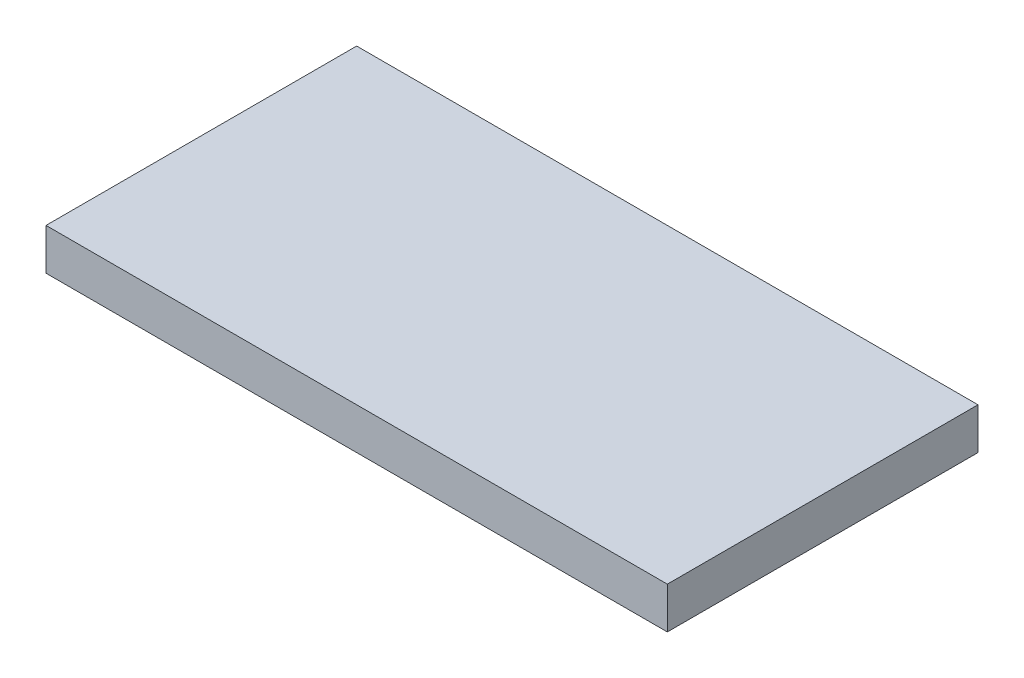
ISO-10303-21;
HEADER;
FILE_DESCRIPTION(('STEP AP214'),'2;1');
FILE_NAME('part.step','',(''),(''),'','','');
FILE_SCHEMA(('AUTOMOTIVE_DESIGN { 1 0 10303 214 1 1 1 1 }'));
ENDSEC;
DATA;
#1=APPLICATION_CONTEXT('core data for automotive mechanical design processes');
#2=APPLICATION_PROTOCOL_DEFINITION('international standard','automotive_design',2000,#1);
#3=PRODUCT_CONTEXT('',#1,'mechanical');
#4=PRODUCT('Part','Part','',(#3));
#5=PRODUCT_RELATED_PRODUCT_CATEGORY('part','',(#4));
#6=PRODUCT_DEFINITION_FORMATION('','',#4);
#7=PRODUCT_DEFINITION_CONTEXT('part definition',#1,'design');
#8=PRODUCT_DEFINITION('design','',#6,#7);
#9=PRODUCT_DEFINITION_SHAPE('','',#8);
#10=(LENGTH_UNIT() NAMED_UNIT(*) SI_UNIT(.MILLI.,.METRE.));
#11=(NAMED_UNIT(*) PLANE_ANGLE_UNIT() SI_UNIT($,.RADIAN.));
#12=(NAMED_UNIT(*) SI_UNIT($,.STERADIAN.) SOLID_ANGLE_UNIT());
#13=UNCERTAINTY_MEASURE_WITH_UNIT(LENGTH_MEASURE(1.E-05),#10,'distance_accuracy_value','');
#14=(GEOMETRIC_REPRESENTATION_CONTEXT(3) GLOBAL_UNCERTAINTY_ASSIGNED_CONTEXT((#13)) GLOBAL_UNIT_ASSIGNED_CONTEXT((#10,
#11,#12)) REPRESENTATION_CONTEXT('',''));
#15=CARTESIAN_POINT('',(0.,0.,0.));
#16=DIRECTION('',(0.,0.,1.));
#17=DIRECTION('',(1.,0.,0.));
#18=AXIS2_PLACEMENT_3D('',#15,#16,#17);
#19=CARTESIAN_POINT('',(0.,9.2,0.));
#20=DIRECTION('',(0.,1.,0.));
#21=DIRECTION('',(0.,0.,1.));
#22=AXIS2_PLACEMENT_3D('',#19,#20,#21);
#23=PLANE('',#22);
#24=DIRECTION('',(0.,0.,1.));
#25=VECTOR('',#24,1.);
#26=CARTESIAN_POINT('',(175.5,9.2,-33.9));
#27=LINE('',#26,#25);
#28=CARTESIAN_POINT('',(175.5,9.2,-61.7));
#29=VERTEX_POINT('',#28);
#30=CARTESIAN_POINT('',(175.5,9.2,-33.9));
#31=VERTEX_POINT('',#30);
#32=EDGE_CURVE('E210',#29,#31,#27,.T.);
#33=ORIENTED_EDGE('',*,*,#32,.F.);
#34=DIRECTION('',(1.,0.,0.));
#35=VECTOR('',#34,1.);
#36=CARTESIAN_POINT('',(175.5,9.2,-61.7));
#37=LINE('',#36,#35);
#38=CARTESIAN_POINT('',(166.9,9.2,-61.7));
#39=VERTEX_POINT('',#38);
#40=EDGE_CURVE('E223',#39,#29,#37,.T.);
#41=ORIENTED_EDGE('',*,*,#40,.F.);
#42=DIRECTION('',(0.,0.,-1.));
#43=VECTOR('',#42,1.);
#44=CARTESIAN_POINT('',(166.9,9.2,-33.9));
#45=LINE('',#44,#43);
#46=CARTESIAN_POINT('',(166.9,9.2,-33.9));
#47=VERTEX_POINT('',#46);
#48=EDGE_CURVE('E232',#47,#39,#45,.T.);
#49=ORIENTED_EDGE('',*,*,#48,.F.);
#50=DIRECTION('',(-1.,0.,0.));
#51=VECTOR('',#50,1.);
#52=CARTESIAN_POINT('',(175.5,9.2,-33.9));
#53=LINE('',#52,#51);
#54=EDGE_CURVE('E213',#31,#47,#53,.T.);
#55=ORIENTED_EDGE('',*,*,#54,.F.);
#56=EDGE_LOOP('',(#33,#41,#49,#55));
#57=FACE_BOUND('',#56,.T.);
#58=DIRECTION('',(0.,0.,1.));
#59=VECTOR('',#58,1.);
#60=CARTESIAN_POINT('',(179.5,9.2,-12.5));
#61=LINE('',#60,#59);
#62=CARTESIAN_POINT('',(179.5,9.2,-83.5));
#63=VERTEX_POINT('',#62);
#64=CARTESIAN_POINT('',(179.5,9.2,-12.5));
#65=VERTEX_POINT('',#64);
#66=EDGE_CURVE('E318',#63,#65,#61,.T.);
#67=ORIENTED_EDGE('',*,*,#66,.T.);
#68=DIRECTION('',(-1.,0.,0.));
#69=VECTOR('',#68,1.);
#70=CARTESIAN_POINT('',(179.5,9.2,-12.5));
#71=LINE('',#70,#69);
#72=CARTESIAN_POINT('',(12.5,9.2,-12.5));
#73=VERTEX_POINT('',#72);
#74=EDGE_CURVE('E321',#65,#73,#71,.T.);
#75=ORIENTED_EDGE('',*,*,#74,.T.);
#76=DIRECTION('',(0.,0.,-1.));
#77=VECTOR('',#76,1.);
#78=CARTESIAN_POINT('',(12.5,9.2,-12.5));
#79=LINE('',#78,#77);
#80=CARTESIAN_POINT('',(12.5,9.2,-83.5));
#81=VERTEX_POINT('',#80);
#82=EDGE_CURVE('E325',#73,#81,#79,.T.);
#83=ORIENTED_EDGE('',*,*,#82,.T.);
#84=DIRECTION('',(1.,0.,0.));
#85=VECTOR('',#84,1.);
#86=CARTESIAN_POINT('',(179.5,9.2,-83.5));
#87=LINE('',#86,#85);
#88=EDGE_CURVE('E328',#81,#63,#87,.T.);
#89=ORIENTED_EDGE('',*,*,#88,.T.);
#90=EDGE_LOOP('',(#67,#75,#83,#89));
#91=FACE_BOUND('',#90,.T.);
#92=DIRECTION('',(0.,0.,-1.));
#93=VECTOR('',#92,1.);
#94=CARTESIAN_POINT('',(16.5,9.2,-33.9));
#95=LINE('',#94,#93);
#96=CARTESIAN_POINT('',(16.5,9.2,-33.9));
#97=VERTEX_POINT('',#96);
#98=CARTESIAN_POINT('',(16.5,9.2,-61.7));
#99=VERTEX_POINT('',#98);
#100=EDGE_CURVE('E248',#97,#99,#95,.T.);
#101=ORIENTED_EDGE('',*,*,#100,.F.);
#102=DIRECTION('',(-1.,0.,0.));
#103=VECTOR('',#102,1.);
#104=CARTESIAN_POINT('',(16.5,9.2,-33.9));
#105=LINE('',#104,#103);
#106=CARTESIAN_POINT('',(25.1,9.2,-33.9));
#107=VERTEX_POINT('',#106);
#108=EDGE_CURVE('E253',#107,#97,#105,.T.);
#109=ORIENTED_EDGE('',*,*,#108,.F.);
#110=DIRECTION('',(0.,0.,1.));
#111=VECTOR('',#110,1.);
#112=CARTESIAN_POINT('',(25.1,9.2,-33.9));
#113=LINE('',#112,#111);
#114=CARTESIAN_POINT('',(25.1,9.2,-61.7));
#115=VERTEX_POINT('',#114);
#116=EDGE_CURVE('E265',#115,#107,#113,.T.);
#117=ORIENTED_EDGE('',*,*,#116,.F.);
#118=DIRECTION('',(1.,0.,0.));
#119=VECTOR('',#118,1.);
#120=CARTESIAN_POINT('',(16.5,9.2,-61.7));
#121=LINE('',#120,#119);
#122=EDGE_CURVE('E262',#99,#115,#121,.T.);
#123=ORIENTED_EDGE('',*,*,#122,.F.);
#124=EDGE_LOOP('',(#101,#109,#117,#123));
#125=FACE_BOUND('',#124,.T.);
#126=DIRECTION('',(0.,0.,-1.));
#127=VECTOR('',#126,1.);
#128=CARTESIAN_POINT('',(106.1,9.2,-39.3));
#129=LINE('',#128,#127);
#130=CARTESIAN_POINT('',(106.1,9.2,-39.3));
#131=VERTEX_POINT('',#130);
#132=CARTESIAN_POINT('',(106.1,9.2,-46.9));
#133=VERTEX_POINT('',#132);
#134=EDGE_CURVE('E209',#131,#133,#129,.T.);
#135=ORIENTED_EDGE('',*,*,#134,.F.);
#136=DIRECTION('',(-1.,0.,0.));
#137=VECTOR('',#136,1.);
#138=CARTESIAN_POINT('',(106.1,9.2,-39.3));
#139=LINE('',#138,#137);
#140=CARTESIAN_POINT('',(122.,9.2,-39.3));
#141=VERTEX_POINT('',#140);
#142=EDGE_CURVE('E206',#141,#131,#139,.T.);
#143=ORIENTED_EDGE('',*,*,#142,.F.);
#144=DIRECTION('',(0.,0.,1.));
#145=VECTOR('',#144,1.);
#146=CARTESIAN_POINT('',(122.,9.2,-39.3));
#147=LINE('',#146,#145);
#148=CARTESIAN_POINT('',(122.,9.2,-46.9));
#149=VERTEX_POINT('',#148);
#150=EDGE_CURVE('E54',#149,#141,#147,.T.);
#151=ORIENTED_EDGE('',*,*,#150,.F.);
#152=DIRECTION('',(1.,0.,0.));
#153=VECTOR('',#152,1.);
#154=CARTESIAN_POINT('',(106.1,9.2,-46.9));
#155=LINE('',#154,#153);
#156=EDGE_CURVE('E49',#133,#149,#155,.T.);
#157=ORIENTED_EDGE('',*,*,#156,.F.);
#158=EDGE_LOOP('',(#135,#143,#151,#157));
#159=FACE_BOUND('',#158,.T.);
#160=ADVANCED_FACE('F34',(#57,#91,#125,#159),#23,.F.);
#161=CARTESIAN_POINT('',(0.,12.8,0.));
#162=DIRECTION('',(1.,0.,0.));
#163=DIRECTION('',(0.,0.,-1.));
#164=AXIS2_PLACEMENT_3D('',#161,#162,#163);
#165=PLANE('',#164);
#166=DIRECTION('',(0.,0.,1.));
#167=VECTOR('',#166,1.);
#168=CARTESIAN_POINT('',(0.,0.,0.));
#169=LINE('',#168,#167);
#170=CARTESIAN_POINT('',(0.,0.,-96.));
#171=VERTEX_POINT('',#170);
#172=CARTESIAN_POINT('',(0.,0.,0.));
#173=VERTEX_POINT('',#172);
#174=EDGE_CURVE('E343',#171,#173,#169,.T.);
#175=ORIENTED_EDGE('',*,*,#174,.T.);
#176=DIRECTION('',(0.,-1.,0.));
#177=VECTOR('',#176,1.);
#178=CARTESIAN_POINT('',(0.,12.8,0.));
#179=LINE('',#178,#177);
#180=CARTESIAN_POINT('',(0.,12.8,0.));
#181=VERTEX_POINT('',#180);
#182=EDGE_CURVE('E11',#181,#173,#179,.T.);
#183=ORIENTED_EDGE('',*,*,#182,.F.);
#184=DIRECTION('',(0.,0.,1.));
#185=VECTOR('',#184,1.);
#186=CARTESIAN_POINT('',(0.,12.8,0.));
#187=LINE('',#186,#185);
#188=CARTESIAN_POINT('',(0.,12.8,-96.));
#189=VERTEX_POINT('',#188);
#190=EDGE_CURVE('E350',#189,#181,#187,.T.);
#191=ORIENTED_EDGE('',*,*,#190,.F.);
#192=DIRECTION('',(0.,-1.,0.));
#193=VECTOR('',#192,1.);
#194=CARTESIAN_POINT('',(0.,12.8,-96.));
#195=LINE('',#194,#193);
#196=EDGE_CURVE('E360',#189,#171,#195,.T.);
#197=ORIENTED_EDGE('',*,*,#196,.T.);
#198=EDGE_LOOP('',(#175,#183,#191,#197));
#199=FACE_BOUND('',#198,.T.);
#200=ADVANCED_FACE('F36',(#199),#165,.F.);
#201=CARTESIAN_POINT('',(0.,12.8,0.));
#202=DIRECTION('',(0.,0.,-1.));
#203=DIRECTION('',(-1.,0.,0.));
#204=AXIS2_PLACEMENT_3D('',#201,#202,#203);
#205=PLANE('',#204);
#206=DIRECTION('',(1.,0.,0.));
#207=VECTOR('',#206,1.);
#208=CARTESIAN_POINT('',(0.,0.,0.));
#209=LINE('',#208,#207);
#210=CARTESIAN_POINT('',(192.,0.,0.));
#211=VERTEX_POINT('',#210);
#212=EDGE_CURVE('E363',#173,#211,#209,.T.);
#213=ORIENTED_EDGE('',*,*,#212,.T.);
#214=DIRECTION('',(0.,-1.,0.));
#215=VECTOR('',#214,1.);
#216=CARTESIAN_POINT('',(192.,12.8,0.));
#217=LINE('',#216,#215);
#218=CARTESIAN_POINT('',(192.,12.8,0.));
#219=VERTEX_POINT('',#218);
#220=EDGE_CURVE('E42',#219,#211,#217,.T.);
#221=ORIENTED_EDGE('',*,*,#220,.F.);
#222=DIRECTION('',(1.,0.,0.));
#223=VECTOR('',#222,1.);
#224=CARTESIAN_POINT('',(0.,12.8,0.));
#225=LINE('',#224,#223);
#226=EDGE_CURVE('E353',#181,#219,#225,.T.);
#227=ORIENTED_EDGE('',*,*,#226,.F.);
#228=ORIENTED_EDGE('',*,*,#182,.T.);
#229=EDGE_LOOP('',(#213,#221,#227,#228));
#230=FACE_BOUND('',#229,.T.);
#231=ADVANCED_FACE('F393',(#230),#205,.F.);
#232=CARTESIAN_POINT('',(192.,12.8,0.));
#233=DIRECTION('',(-1.,0.,0.));
#234=DIRECTION('',(0.,0.,1.));
#235=AXIS2_PLACEMENT_3D('',#232,#233,#234);
#236=PLANE('',#235);
#237=DIRECTION('',(0.,0.,-1.));
#238=VECTOR('',#237,1.);
#239=CARTESIAN_POINT('',(192.,0.,0.));
#240=LINE('',#239,#238);
#241=CARTESIAN_POINT('',(192.,0.,-96.));
#242=VERTEX_POINT('',#241);
#243=EDGE_CURVE('E365',#211,#242,#240,.T.);
#244=ORIENTED_EDGE('',*,*,#243,.T.);
#245=DIRECTION('',(0.,-1.,0.));
#246=VECTOR('',#245,1.);
#247=CARTESIAN_POINT('',(192.,12.8,-96.));
#248=LINE('',#247,#246);
#249=CARTESIAN_POINT('',(192.,12.8,-96.));
#250=VERTEX_POINT('',#249);
#251=EDGE_CURVE('E370',#250,#242,#248,.T.);
#252=ORIENTED_EDGE('',*,*,#251,.F.);
#253=DIRECTION('',(0.,0.,-1.));
#254=VECTOR('',#253,1.);
#255=CARTESIAN_POINT('',(192.,12.8,0.));
#256=LINE('',#255,#254);
#257=EDGE_CURVE('E356',#219,#250,#256,.T.);
#258=ORIENTED_EDGE('',*,*,#257,.F.);
#259=ORIENTED_EDGE('',*,*,#220,.T.);
#260=EDGE_LOOP('',(#244,#252,#258,#259));
#261=FACE_BOUND('',#260,.T.);
#262=ADVANCED_FACE('F377',(#261),#236,.F.);
#263=CARTESIAN_POINT('',(0.,12.8,-96.));
#264=DIRECTION('',(0.,0.,1.));
#265=DIRECTION('',(1.,0.,0.));
#266=AXIS2_PLACEMENT_3D('',#263,#264,#265);
#267=PLANE('',#266);
#268=DIRECTION('',(-1.,0.,0.));
#269=VECTOR('',#268,1.);
#270=CARTESIAN_POINT('',(0.,0.,-96.));
#271=LINE('',#270,#269);
#272=EDGE_CURVE('E354',#242,#171,#271,.T.);
#273=ORIENTED_EDGE('',*,*,#272,.T.);
#274=ORIENTED_EDGE('',*,*,#196,.F.);
#275=DIRECTION('',(-1.,0.,0.));
#276=VECTOR('',#275,1.);
#277=CARTESIAN_POINT('',(0.,12.8,-96.));
#278=LINE('',#277,#276);
#279=EDGE_CURVE('E358',#250,#189,#278,.T.);
#280=ORIENTED_EDGE('',*,*,#279,.F.);
#281=ORIENTED_EDGE('',*,*,#251,.T.);
#282=EDGE_LOOP('',(#273,#274,#280,#281));
#283=FACE_BOUND('',#282,.T.);
#284=ADVANCED_FACE('F386',(#283),#267,.F.);
#285=CARTESIAN_POINT('',(0.,12.8,0.));
#286=DIRECTION('',(0.,-1.,0.));
#287=DIRECTION('',(0.,0.,-1.));
#288=AXIS2_PLACEMENT_3D('',#285,#286,#287);
#289=PLANE('',#288);
#290=ORIENTED_EDGE('',*,*,#190,.T.);
#291=ORIENTED_EDGE('',*,*,#226,.T.);
#292=ORIENTED_EDGE('',*,*,#257,.T.);
#293=ORIENTED_EDGE('',*,*,#279,.T.);
#294=EDGE_LOOP('',(#290,#291,#292,#293));
#295=FACE_BOUND('',#294,.T.);
#296=ADVANCED_FACE('F392',(#295),#289,.F.);
#297=CARTESIAN_POINT('',(0.,0.,0.));
#298=DIRECTION('',(0.,-1.,0.));
#299=DIRECTION('',(0.,0.,-1.));
#300=AXIS2_PLACEMENT_3D('',#297,#298,#299);
#301=PLANE('',#300);
#302=CARTESIAN_POINT('',(13.,0.,-9.1));
#303=DIRECTION('',(0.,-1.,0.));
#304=DIRECTION('',(0.,0.,-1.));
#305=AXIS2_PLACEMENT_3D('',#302,#303,#304);
#306=CIRCLE('',#305,1.7);
#307=CARTESIAN_POINT('',(13.,0.,-10.8));
#308=VERTEX_POINT('',#307);
#309=EDGE_CURVE('E281',#308,#308,#306,.T.);
#310=ORIENTED_EDGE('',*,*,#309,.F.);
#311=EDGE_LOOP('',(#310));
#312=FACE_BOUND('',#311,.T.);
#313=CARTESIAN_POINT('',(96.,0.,-9.1));
#314=DIRECTION('',(0.,-1.,0.));
#315=DIRECTION('',(0.,0.,-1.));
#316=AXIS2_PLACEMENT_3D('',#313,#314,#315);
#317=CIRCLE('',#316,1.69999999999999);
#318=CARTESIAN_POINT('',(96.,0.,-10.8));
#319=VERTEX_POINT('',#318);
#320=EDGE_CURVE('E287',#319,#319,#317,.T.);
#321=ORIENTED_EDGE('',*,*,#320,.F.);
#322=EDGE_LOOP('',(#321));
#323=FACE_BOUND('',#322,.T.);
#324=CARTESIAN_POINT('',(179.,0.,-9.1));
#325=DIRECTION('',(0.,-1.,0.));
#326=DIRECTION('',(0.,0.,-1.));
#327=AXIS2_PLACEMENT_3D('',#324,#325,#326);
#328=CIRCLE('',#327,1.70000000000001);
#329=CARTESIAN_POINT('',(179.,0.,-10.8));
#330=VERTEX_POINT('',#329);
#331=EDGE_CURVE('E293',#330,#330,#328,.T.);
#332=ORIENTED_EDGE('',*,*,#331,.F.);
#333=EDGE_LOOP('',(#332));
#334=FACE_BOUND('',#333,.T.);
#335=CARTESIAN_POINT('',(179.,0.,-86.9));
#336=DIRECTION('',(0.,-1.,0.));
#337=DIRECTION('',(0.,0.,-1.));
#338=AXIS2_PLACEMENT_3D('',#335,#336,#337);
#339=CIRCLE('',#338,1.70000000000001);
#340=CARTESIAN_POINT('',(179.,0.,-88.6));
#341=VERTEX_POINT('',#340);
#342=EDGE_CURVE('E299',#341,#341,#339,.T.);
#343=ORIENTED_EDGE('',*,*,#342,.F.);
#344=EDGE_LOOP('',(#343));
#345=FACE_BOUND('',#344,.T.);
#346=CARTESIAN_POINT('',(96.,0.,-86.9));
#347=DIRECTION('',(0.,-1.,0.));
#348=DIRECTION('',(0.,0.,-1.));
#349=AXIS2_PLACEMENT_3D('',#346,#347,#348);
#350=CIRCLE('',#349,1.69999999999999);
#351=CARTESIAN_POINT('',(96.,0.,-88.6));
#352=VERTEX_POINT('',#351);
#353=EDGE_CURVE('E305',#352,#352,#350,.T.);
#354=ORIENTED_EDGE('',*,*,#353,.F.);
#355=EDGE_LOOP('',(#354));
#356=FACE_BOUND('',#355,.T.);
#357=CARTESIAN_POINT('',(13.,0.,-86.9));
#358=DIRECTION('',(0.,-1.,0.));
#359=DIRECTION('',(0.,0.,-1.));
#360=AXIS2_PLACEMENT_3D('',#357,#358,#359);
#361=CIRCLE('',#360,1.7);
#362=CARTESIAN_POINT('',(13.,0.,-88.6));
#363=VERTEX_POINT('',#362);
#364=EDGE_CURVE('E311',#363,#363,#361,.T.);
#365=ORIENTED_EDGE('',*,*,#364,.F.);
#366=EDGE_LOOP('',(#365));
#367=FACE_BOUND('',#366,.T.);
#368=DIRECTION('',(0.,0.,1.));
#369=VECTOR('',#368,1.);
#370=CARTESIAN_POINT('',(179.5,0.,-12.5));
#371=LINE('',#370,#369);
#372=CARTESIAN_POINT('',(179.5,0.,-83.5));
#373=VERTEX_POINT('',#372);
#374=CARTESIAN_POINT('',(179.5,0.,-12.5));
#375=VERTEX_POINT('',#374);
#376=EDGE_CURVE('E317',#373,#375,#371,.T.);
#377=ORIENTED_EDGE('',*,*,#376,.F.);
#378=DIRECTION('',(1.,0.,0.));
#379=VECTOR('',#378,1.);
#380=CARTESIAN_POINT('',(179.5,0.,-83.5));
#381=LINE('',#380,#379);
#382=CARTESIAN_POINT('',(12.5,0.,-83.5));
#383=VERTEX_POINT('',#382);
#384=EDGE_CURVE('E322',#383,#373,#381,.T.);
#385=ORIENTED_EDGE('',*,*,#384,.F.);
#386=DIRECTION('',(0.,0.,-1.));
#387=VECTOR('',#386,1.);
#388=CARTESIAN_POINT('',(12.5,0.,-12.5));
#389=LINE('',#388,#387);
#390=CARTESIAN_POINT('',(12.5,0.,-12.5));
#391=VERTEX_POINT('',#390);
#392=EDGE_CURVE('E336',#391,#383,#389,.T.);
#393=ORIENTED_EDGE('',*,*,#392,.F.);
#394=DIRECTION('',(-1.,0.,0.));
#395=VECTOR('',#394,1.);
#396=CARTESIAN_POINT('',(179.5,0.,-12.5));
#397=LINE('',#396,#395);
#398=EDGE_CURVE('E333',#375,#391,#397,.T.);
#399=ORIENTED_EDGE('',*,*,#398,.F.);
#400=EDGE_LOOP('',(#377,#385,#393,#399));
#401=FACE_BOUND('',#400,.T.);
#402=ORIENTED_EDGE('',*,*,#174,.F.);
#403=ORIENTED_EDGE('',*,*,#272,.F.);
#404=ORIENTED_EDGE('',*,*,#243,.F.);
#405=ORIENTED_EDGE('',*,*,#212,.F.);
#406=EDGE_LOOP('',(#402,#403,#404,#405));
#407=FACE_BOUND('',#406,.T.);
#408=ADVANCED_FACE('F383',(#312,#323,#334,#345,#356,#367,#401,#407),#301,.T.);
#409=CARTESIAN_POINT('',(179.5,9.2,-12.5));
#410=DIRECTION('',(1.,0.,0.));
#411=DIRECTION('',(0.,0.,-1.));
#412=AXIS2_PLACEMENT_3D('',#409,#410,#411);
#413=PLANE('',#412);
#414=ORIENTED_EDGE('',*,*,#376,.T.);
#415=DIRECTION('',(0.,-1.,0.));
#416=VECTOR('',#415,1.);
#417=CARTESIAN_POINT('',(179.5,9.2,-12.5));
#418=LINE('',#417,#416);
#419=EDGE_CURVE('E331',#65,#375,#418,.T.);
#420=ORIENTED_EDGE('',*,*,#419,.F.);
#421=ORIENTED_EDGE('',*,*,#66,.F.);
#422=DIRECTION('',(0.,-1.,0.));
#423=VECTOR('',#422,1.);
#424=CARTESIAN_POINT('',(179.5,9.2,-83.5));
#425=LINE('',#424,#423);
#426=EDGE_CURVE('E341',#63,#373,#425,.T.);
#427=ORIENTED_EDGE('',*,*,#426,.T.);
#428=EDGE_LOOP('',(#414,#420,#421,#427));
#429=FACE_BOUND('',#428,.T.);
#430=ADVANCED_FACE('F414',(#429),#413,.F.);
#431=CARTESIAN_POINT('',(179.5,9.2,-83.5));
#432=DIRECTION('',(0.,0.,-1.));
#433=DIRECTION('',(-1.,0.,0.));
#434=AXIS2_PLACEMENT_3D('',#431,#432,#433);
#435=PLANE('',#434);
#436=ORIENTED_EDGE('',*,*,#384,.T.);
#437=ORIENTED_EDGE('',*,*,#426,.F.);
#438=ORIENTED_EDGE('',*,*,#88,.F.);
#439=DIRECTION('',(0.,-1.,0.));
#440=VECTOR('',#439,1.);
#441=CARTESIAN_POINT('',(12.5,9.2,-83.5));
#442=LINE('',#441,#440);
#443=EDGE_CURVE('E344',#81,#383,#442,.T.);
#444=ORIENTED_EDGE('',*,*,#443,.T.);
#445=EDGE_LOOP('',(#436,#437,#438,#444));
#446=FACE_BOUND('',#445,.T.);
#447=ADVANCED_FACE('F410',(#446),#435,.F.);
#448=CARTESIAN_POINT('',(12.5,9.2,-12.5));
#449=DIRECTION('',(-1.,0.,0.));
#450=DIRECTION('',(0.,0.,1.));
#451=AXIS2_PLACEMENT_3D('',#448,#449,#450);
#452=PLANE('',#451);
#453=ORIENTED_EDGE('',*,*,#392,.T.);
#454=ORIENTED_EDGE('',*,*,#443,.F.);
#455=ORIENTED_EDGE('',*,*,#82,.F.);
#456=DIRECTION('',(0.,-1.,0.));
#457=VECTOR('',#456,1.);
#458=CARTESIAN_POINT('',(12.5,9.2,-12.5));
#459=LINE('',#458,#457);
#460=EDGE_CURVE('E346',#73,#391,#459,.T.);
#461=ORIENTED_EDGE('',*,*,#460,.T.);
#462=EDGE_LOOP('',(#453,#454,#455,#461));
#463=FACE_BOUND('',#462,.T.);
#464=ADVANCED_FACE('F413',(#463),#452,.F.);
#465=CARTESIAN_POINT('',(179.5,9.2,-12.5));
#466=DIRECTION('',(0.,0.,1.));
#467=DIRECTION('',(1.,0.,0.));
#468=AXIS2_PLACEMENT_3D('',#465,#466,#467);
#469=PLANE('',#468);
#470=ORIENTED_EDGE('',*,*,#398,.T.);
#471=ORIENTED_EDGE('',*,*,#460,.F.);
#472=ORIENTED_EDGE('',*,*,#74,.F.);
#473=ORIENTED_EDGE('',*,*,#419,.T.);
#474=EDGE_LOOP('',(#470,#471,#472,#473));
#475=FACE_BOUND('',#474,.T.);
#476=ADVANCED_FACE('F418',(#475),#469,.F.);
#477=CARTESIAN_POINT('',(13.,5.,-86.9));
#478=DIRECTION('',(0.,-1.,0.));
#479=DIRECTION('',(0.,0.,-1.));
#480=AXIS2_PLACEMENT_3D('',#477,#478,#479);
#481=CONICAL_SURFACE('',#480,1.7,1.02974425867665);
#482=CARTESIAN_POINT('',(13.,6.02146305234685,-86.9));
#483=VERTEX_POINT('',#482);
#484=VERTEX_LOOP('',#483);
#485=FACE_BOUND('',#484,.T.);
#486=CARTESIAN_POINT('',(13.,5.,-86.9));
#487=DIRECTION('',(0.,-1.,0.));
#488=DIRECTION('',(0.,0.,-1.));
#489=AXIS2_PLACEMENT_3D('',#486,#487,#488);
#490=CIRCLE('',#489,1.7);
#491=CARTESIAN_POINT('',(13.,5.,-88.6));
#492=VERTEX_POINT('',#491);
#493=EDGE_CURVE('E314',#492,#492,#490,.T.);
#494=ORIENTED_EDGE('',*,*,#493,.T.);
#495=EDGE_LOOP('',(#494));
#496=FACE_BOUND('',#495,.T.);
#497=ADVANCED_FACE('F408',(#485,#496),#481,.F.);
#498=CARTESIAN_POINT('',(13.,0.,-86.9));
#499=DIRECTION('',(0.,-1.,0.));
#500=DIRECTION('',(0.,0.,-1.));
#501=AXIS2_PLACEMENT_3D('',#498,#499,#500);
#502=CYLINDRICAL_SURFACE('',#501,1.7);
#503=ORIENTED_EDGE('',*,*,#493,.F.);
#504=EDGE_LOOP('',(#503));
#505=FACE_BOUND('',#504,.T.);
#506=ORIENTED_EDGE('',*,*,#364,.T.);
#507=EDGE_LOOP('',(#506));
#508=FACE_BOUND('',#507,.T.);
#509=ADVANCED_FACE('F466',(#505,#508),#502,.F.);
#510=CARTESIAN_POINT('',(96.,5.,-86.9));
#511=DIRECTION('',(0.,-1.,0.));
#512=DIRECTION('',(0.,0.,-1.));
#513=AXIS2_PLACEMENT_3D('',#510,#511,#512);
#514=CONICAL_SURFACE('',#513,1.69999999999999,1.02974425867665);
#515=CARTESIAN_POINT('',(96.,6.02146305234685,-86.9));
#516=VERTEX_POINT('',#515);
#517=VERTEX_LOOP('',#516);
#518=FACE_BOUND('',#517,.T.);
#519=CARTESIAN_POINT('',(96.,5.,-86.9));
#520=DIRECTION('',(0.,-1.,0.));
#521=DIRECTION('',(0.,0.,-1.));
#522=AXIS2_PLACEMENT_3D('',#519,#520,#521);
#523=CIRCLE('',#522,1.69999999999999);
#524=CARTESIAN_POINT('',(96.,5.,-88.6));
#525=VERTEX_POINT('',#524);
#526=EDGE_CURVE('E308',#525,#525,#523,.T.);
#527=ORIENTED_EDGE('',*,*,#526,.T.);
#528=EDGE_LOOP('',(#527));
#529=FACE_BOUND('',#528,.T.);
#530=ADVANCED_FACE('F473',(#518,#529),#514,.F.);
#531=CARTESIAN_POINT('',(96.,0.,-86.9));
#532=DIRECTION('',(0.,-1.,0.));
#533=DIRECTION('',(0.,0.,-1.));
#534=AXIS2_PLACEMENT_3D('',#531,#532,#533);
#535=CYLINDRICAL_SURFACE('',#534,1.69999999999999);
#536=ORIENTED_EDGE('',*,*,#526,.F.);
#537=EDGE_LOOP('',(#536));
#538=FACE_BOUND('',#537,.T.);
#539=ORIENTED_EDGE('',*,*,#353,.T.);
#540=EDGE_LOOP('',(#539));
#541=FACE_BOUND('',#540,.T.);
#542=ADVANCED_FACE('F480',(#538,#541),#535,.F.);
#543=CARTESIAN_POINT('',(179.,5.,-86.9));
#544=DIRECTION('',(0.,-1.,0.));
#545=DIRECTION('',(0.,0.,-1.));
#546=AXIS2_PLACEMENT_3D('',#543,#544,#545);
#547=CONICAL_SURFACE('',#546,1.70000000000001,1.02974425867666);
#548=CARTESIAN_POINT('',(179.,6.02146305234685,-86.9));
#549=VERTEX_POINT('',#548);
#550=VERTEX_LOOP('',#549);
#551=FACE_BOUND('',#550,.T.);
#552=CARTESIAN_POINT('',(179.,5.,-86.9));
#553=DIRECTION('',(0.,-1.,0.));
#554=DIRECTION('',(0.,0.,-1.));
#555=AXIS2_PLACEMENT_3D('',#552,#553,#554);
#556=CIRCLE('',#555,1.70000000000001);
#557=CARTESIAN_POINT('',(179.,5.,-88.6));
#558=VERTEX_POINT('',#557);
#559=EDGE_CURVE('E302',#558,#558,#556,.T.);
#560=ORIENTED_EDGE('',*,*,#559,.T.);
#561=EDGE_LOOP('',(#560));
#562=FACE_BOUND('',#561,.T.);
#563=ADVANCED_FACE('F488',(#551,#562),#547,.F.);
#564=CARTESIAN_POINT('',(179.,0.,-86.9));
#565=DIRECTION('',(0.,-1.,0.));
#566=DIRECTION('',(0.,0.,-1.));
#567=AXIS2_PLACEMENT_3D('',#564,#565,#566);
#568=CYLINDRICAL_SURFACE('',#567,1.70000000000001);
#569=ORIENTED_EDGE('',*,*,#559,.F.);
#570=EDGE_LOOP('',(#569));
#571=FACE_BOUND('',#570,.T.);
#572=ORIENTED_EDGE('',*,*,#342,.T.);
#573=EDGE_LOOP('',(#572));
#574=FACE_BOUND('',#573,.T.);
#575=ADVANCED_FACE('F496',(#571,#574),#568,.F.);
#576=CARTESIAN_POINT('',(179.,5.,-9.1));
#577=DIRECTION('',(0.,-1.,0.));
#578=DIRECTION('',(0.,0.,-1.));
#579=AXIS2_PLACEMENT_3D('',#576,#577,#578);
#580=CONICAL_SURFACE('',#579,1.70000000000001,1.02974425867666);
#581=CARTESIAN_POINT('',(179.,6.02146305234685,-9.1));
#582=VERTEX_POINT('',#581);
#583=VERTEX_LOOP('',#582);
#584=FACE_BOUND('',#583,.T.);
#585=CARTESIAN_POINT('',(179.,5.,-9.1));
#586=DIRECTION('',(0.,-1.,0.));
#587=DIRECTION('',(0.,0.,-1.));
#588=AXIS2_PLACEMENT_3D('',#585,#586,#587);
#589=CIRCLE('',#588,1.70000000000001);
#590=CARTESIAN_POINT('',(179.,5.,-10.8));
#591=VERTEX_POINT('',#590);
#592=EDGE_CURVE('E296',#591,#591,#589,.T.);
#593=ORIENTED_EDGE('',*,*,#592,.T.);
#594=EDGE_LOOP('',(#593));
#595=FACE_BOUND('',#594,.T.);
#596=ADVANCED_FACE('F504',(#584,#595),#580,.F.);
#597=CARTESIAN_POINT('',(179.,0.,-9.1));
#598=DIRECTION('',(0.,-1.,0.));
#599=DIRECTION('',(0.,0.,-1.));
#600=AXIS2_PLACEMENT_3D('',#597,#598,#599);
#601=CYLINDRICAL_SURFACE('',#600,1.70000000000001);
#602=ORIENTED_EDGE('',*,*,#592,.F.);
#603=EDGE_LOOP('',(#602));
#604=FACE_BOUND('',#603,.T.);
#605=ORIENTED_EDGE('',*,*,#331,.T.);
#606=EDGE_LOOP('',(#605));
#607=FACE_BOUND('',#606,.T.);
#608=ADVANCED_FACE('F512',(#604,#607),#601,.F.);
#609=CARTESIAN_POINT('',(96.,5.,-9.1));
#610=DIRECTION('',(0.,-1.,0.));
#611=DIRECTION('',(0.,0.,-1.));
#612=AXIS2_PLACEMENT_3D('',#609,#610,#611);
#613=CONICAL_SURFACE('',#612,1.69999999999999,1.02974425867665);
#614=CARTESIAN_POINT('',(96.,6.02146305234685,-9.1));
#615=VERTEX_POINT('',#614);
#616=VERTEX_LOOP('',#615);
#617=FACE_BOUND('',#616,.T.);
#618=CARTESIAN_POINT('',(96.,5.,-9.1));
#619=DIRECTION('',(0.,-1.,0.));
#620=DIRECTION('',(0.,0.,-1.));
#621=AXIS2_PLACEMENT_3D('',#618,#619,#620);
#622=CIRCLE('',#621,1.69999999999999);
#623=CARTESIAN_POINT('',(96.,5.,-10.8));
#624=VERTEX_POINT('',#623);
#625=EDGE_CURVE('E290',#624,#624,#622,.T.);
#626=ORIENTED_EDGE('',*,*,#625,.T.);
#627=EDGE_LOOP('',(#626));
#628=FACE_BOUND('',#627,.T.);
#629=ADVANCED_FACE('F520',(#617,#628),#613,.F.);
#630=CARTESIAN_POINT('',(96.,0.,-9.1));
#631=DIRECTION('',(0.,-1.,0.));
#632=DIRECTION('',(0.,0.,-1.));
#633=AXIS2_PLACEMENT_3D('',#630,#631,#632);
#634=CYLINDRICAL_SURFACE('',#633,1.69999999999999);
#635=ORIENTED_EDGE('',*,*,#625,.F.);
#636=EDGE_LOOP('',(#635));
#637=FACE_BOUND('',#636,.T.);
#638=ORIENTED_EDGE('',*,*,#320,.T.);
#639=EDGE_LOOP('',(#638));
#640=FACE_BOUND('',#639,.T.);
#641=ADVANCED_FACE('F528',(#637,#640),#634,.F.);
#642=CARTESIAN_POINT('',(13.,5.,-9.1));
#643=DIRECTION('',(0.,-1.,0.));
#644=DIRECTION('',(0.,0.,-1.));
#645=AXIS2_PLACEMENT_3D('',#642,#643,#644);
#646=CONICAL_SURFACE('',#645,1.7,1.02974425867665);
#647=CARTESIAN_POINT('',(13.,6.02146305234685,-9.1));
#648=VERTEX_POINT('',#647);
#649=VERTEX_LOOP('',#648);
#650=FACE_BOUND('',#649,.T.);
#651=CARTESIAN_POINT('',(13.,5.,-9.1));
#652=DIRECTION('',(0.,-1.,0.));
#653=DIRECTION('',(0.,0.,-1.));
#654=AXIS2_PLACEMENT_3D('',#651,#652,#653);
#655=CIRCLE('',#654,1.7);
#656=CARTESIAN_POINT('',(13.,5.,-10.8));
#657=VERTEX_POINT('',#656);
#658=EDGE_CURVE('E284',#657,#657,#655,.T.);
#659=ORIENTED_EDGE('',*,*,#658,.T.);
#660=EDGE_LOOP('',(#659));
#661=FACE_BOUND('',#660,.T.);
#662=ADVANCED_FACE('F536',(#650,#661),#646,.F.);
#663=CARTESIAN_POINT('',(13.,0.,-9.1));
#664=DIRECTION('',(0.,-1.,0.));
#665=DIRECTION('',(0.,0.,-1.));
#666=AXIS2_PLACEMENT_3D('',#663,#664,#665);
#667=CYLINDRICAL_SURFACE('',#666,1.7);
#668=ORIENTED_EDGE('',*,*,#658,.F.);
#669=EDGE_LOOP('',(#668));
#670=FACE_BOUND('',#669,.T.);
#671=ORIENTED_EDGE('',*,*,#309,.T.);
#672=EDGE_LOOP('',(#671));
#673=FACE_BOUND('',#672,.T.);
#674=ADVANCED_FACE('F544',(#670,#673),#667,.F.);
#675=CARTESIAN_POINT('',(16.5,-0.399999999999999,-33.9));
#676=DIRECTION('',(1.,0.,0.));
#677=DIRECTION('',(0.,0.,-1.));
#678=AXIS2_PLACEMENT_3D('',#675,#676,#677);
#679=PLANE('',#678);
#680=ORIENTED_EDGE('',*,*,#100,.T.);
#681=DIRECTION('',(0.,1.,0.));
#682=VECTOR('',#681,1.);
#683=CARTESIAN_POINT('',(16.5,-0.399999999999999,-61.7));
#684=LINE('',#683,#682);
#685=CARTESIAN_POINT('',(16.5,-0.399999999999999,-61.7));
#686=VERTEX_POINT('',#685);
#687=EDGE_CURVE('E278',#686,#99,#684,.T.);
#688=ORIENTED_EDGE('',*,*,#687,.F.);
#689=DIRECTION('',(0.,0.,-1.));
#690=VECTOR('',#689,1.);
#691=CARTESIAN_POINT('',(16.5,-0.399999999999999,-33.9));
#692=LINE('',#691,#690);
#693=CARTESIAN_POINT('',(16.5,-0.399999999999999,-33.9));
#694=VERTEX_POINT('',#693);
#695=EDGE_CURVE('E249',#694,#686,#692,.T.);
#696=ORIENTED_EDGE('',*,*,#695,.F.);
#697=DIRECTION('',(0.,1.,0.));
#698=VECTOR('',#697,1.);
#699=CARTESIAN_POINT('',(16.5,-0.399999999999999,-33.9));
#700=LINE('',#699,#698);
#701=EDGE_CURVE('E259',#694,#97,#700,.T.);
#702=ORIENTED_EDGE('',*,*,#701,.T.);
#703=EDGE_LOOP('',(#680,#688,#696,#702));
#704=FACE_BOUND('',#703,.T.);
#705=ADVANCED_FACE('F552',(#704),#679,.F.);
#706=CARTESIAN_POINT('',(16.5,-0.399999999999999,-61.7));
#707=DIRECTION('',(0.,0.,1.));
#708=DIRECTION('',(1.,0.,0.));
#709=AXIS2_PLACEMENT_3D('',#706,#707,#708);
#710=PLANE('',#709);
#711=ORIENTED_EDGE('',*,*,#122,.T.);
#712=DIRECTION('',(0.,1.,0.));
#713=VECTOR('',#712,1.);
#714=CARTESIAN_POINT('',(25.1,-0.399999999999999,-61.7));
#715=LINE('',#714,#713);
#716=CARTESIAN_POINT('',(25.1,-0.399999999999999,-61.7));
#717=VERTEX_POINT('',#716);
#718=EDGE_CURVE('E275',#717,#115,#715,.T.);
#719=ORIENTED_EDGE('',*,*,#718,.F.);
#720=DIRECTION('',(1.,0.,0.));
#721=VECTOR('',#720,1.);
#722=CARTESIAN_POINT('',(16.5,-0.399999999999999,-61.7));
#723=LINE('',#722,#721);
#724=EDGE_CURVE('E252',#686,#717,#723,.T.);
#725=ORIENTED_EDGE('',*,*,#724,.F.);
#726=ORIENTED_EDGE('',*,*,#687,.T.);
#727=EDGE_LOOP('',(#711,#719,#725,#726));
#728=FACE_BOUND('',#727,.T.);
#729=ADVANCED_FACE('F560',(#728),#710,.F.);
#730=CARTESIAN_POINT('',(25.1,-0.399999999999999,-33.9));
#731=DIRECTION('',(-1.,0.,0.));
#732=DIRECTION('',(0.,0.,1.));
#733=AXIS2_PLACEMENT_3D('',#730,#731,#732);
#734=PLANE('',#733);
#735=ORIENTED_EDGE('',*,*,#116,.T.);
#736=DIRECTION('',(0.,1.,0.));
#737=VECTOR('',#736,1.);
#738=CARTESIAN_POINT('',(25.1,-0.399999999999999,-33.9));
#739=LINE('',#738,#737);
#740=CARTESIAN_POINT('',(25.1,-0.399999999999999,-33.9));
#741=VERTEX_POINT('',#740);
#742=EDGE_CURVE('E272',#741,#107,#739,.T.);
#743=ORIENTED_EDGE('',*,*,#742,.F.);
#744=DIRECTION('',(0.,0.,1.));
#745=VECTOR('',#744,1.);
#746=CARTESIAN_POINT('',(25.1,-0.399999999999999,-33.9));
#747=LINE('',#746,#745);
#748=EDGE_CURVE('E255',#717,#741,#747,.T.);
#749=ORIENTED_EDGE('',*,*,#748,.F.);
#750=ORIENTED_EDGE('',*,*,#718,.T.);
#751=EDGE_LOOP('',(#735,#743,#749,#750));
#752=FACE_BOUND('',#751,.T.);
#753=ADVANCED_FACE('F568',(#752),#734,.F.);
#754=CARTESIAN_POINT('',(16.5,-0.399999999999999,-33.9));
#755=DIRECTION('',(0.,0.,-1.));
#756=DIRECTION('',(-1.,0.,0.));
#757=AXIS2_PLACEMENT_3D('',#754,#755,#756);
#758=PLANE('',#757);
#759=ORIENTED_EDGE('',*,*,#108,.T.);
#760=ORIENTED_EDGE('',*,*,#701,.F.);
#761=DIRECTION('',(-1.,0.,0.));
#762=VECTOR('',#761,1.);
#763=CARTESIAN_POINT('',(16.5,-0.399999999999999,-33.9));
#764=LINE('',#763,#762);
#765=EDGE_CURVE('E257',#741,#694,#764,.T.);
#766=ORIENTED_EDGE('',*,*,#765,.F.);
#767=ORIENTED_EDGE('',*,*,#742,.T.);
#768=EDGE_LOOP('',(#759,#760,#766,#767));
#769=FACE_BOUND('',#768,.T.);
#770=ADVANCED_FACE('F576',(#769),#758,.F.);
#771=CARTESIAN_POINT('',(0.,-0.399999999999999,0.));
#772=DIRECTION('',(0.,-1.,0.));
#773=DIRECTION('',(0.,0.,-1.));
#774=AXIS2_PLACEMENT_3D('',#771,#772,#773);
#775=PLANE('',#774);
#776=ORIENTED_EDGE('',*,*,#695,.T.);
#777=ORIENTED_EDGE('',*,*,#724,.T.);
#778=ORIENTED_EDGE('',*,*,#748,.T.);
#779=ORIENTED_EDGE('',*,*,#765,.T.);
#780=EDGE_LOOP('',(#776,#777,#778,#779));
#781=FACE_BOUND('',#780,.T.);
#782=ADVANCED_FACE('F584',(#781),#775,.T.);
#783=CARTESIAN_POINT('',(175.5,-0.399999999999999,-33.9));
#784=DIRECTION('',(-1.,0.,0.));
#785=DIRECTION('',(0.,0.,1.));
#786=AXIS2_PLACEMENT_3D('',#783,#784,#785);
#787=PLANE('',#786);
#788=ORIENTED_EDGE('',*,*,#32,.T.);
#789=DIRECTION('',(0.,1.,0.));
#790=VECTOR('',#789,1.);
#791=CARTESIAN_POINT('',(175.5,-0.399999999999999,-33.9));
#792=LINE('',#791,#790);
#793=CARTESIAN_POINT('',(175.5,-0.399999999999999,-33.9));
#794=VERTEX_POINT('',#793);
#795=EDGE_CURVE('E245',#794,#31,#792,.T.);
#796=ORIENTED_EDGE('',*,*,#795,.F.);
#797=DIRECTION('',(0.,0.,1.));
#798=VECTOR('',#797,1.);
#799=CARTESIAN_POINT('',(175.5,-0.399999999999999,-33.9));
#800=LINE('',#799,#798);
#801=CARTESIAN_POINT('',(175.5,-0.399999999999999,-61.7));
#802=VERTEX_POINT('',#801);
#803=EDGE_CURVE('E219',#802,#794,#800,.T.);
#804=ORIENTED_EDGE('',*,*,#803,.F.);
#805=DIRECTION('',(0.,1.,0.));
#806=VECTOR('',#805,1.);
#807=CARTESIAN_POINT('',(175.5,-0.399999999999999,-61.7));
#808=LINE('',#807,#806);
#809=EDGE_CURVE('E228',#802,#29,#808,.T.);
#810=ORIENTED_EDGE('',*,*,#809,.T.);
#811=EDGE_LOOP('',(#788,#796,#804,#810));
#812=FACE_BOUND('',#811,.T.);
#813=ADVANCED_FACE('F593',(#812),#787,.F.);
#814=CARTESIAN_POINT('',(175.5,-0.399999999999999,-33.9));
#815=DIRECTION('',(0.,0.,-1.));
#816=DIRECTION('',(-1.,0.,0.));
#817=AXIS2_PLACEMENT_3D('',#814,#815,#816);
#818=PLANE('',#817);
#819=ORIENTED_EDGE('',*,*,#54,.T.);
#820=DIRECTION('',(0.,1.,0.));
#821=VECTOR('',#820,1.);
#822=CARTESIAN_POINT('',(166.9,-0.399999999999999,-33.9));
#823=LINE('',#822,#821);
#824=CARTESIAN_POINT('',(166.9,-0.399999999999999,-33.9));
#825=VERTEX_POINT('',#824);
#826=EDGE_CURVE('E242',#825,#47,#823,.T.);
#827=ORIENTED_EDGE('',*,*,#826,.F.);
#828=DIRECTION('',(-1.,0.,0.));
#829=VECTOR('',#828,1.);
#830=CARTESIAN_POINT('',(175.5,-0.399999999999999,-33.9));
#831=LINE('',#830,#829);
#832=EDGE_CURVE('E222',#794,#825,#831,.T.);
#833=ORIENTED_EDGE('',*,*,#832,.F.);
#834=ORIENTED_EDGE('',*,*,#795,.T.);
#835=EDGE_LOOP('',(#819,#827,#833,#834));
#836=FACE_BOUND('',#835,.T.);
#837=ADVANCED_FACE('F602',(#836),#818,.F.);
#838=CARTESIAN_POINT('',(166.9,-0.399999999999999,-33.9));
#839=DIRECTION('',(1.,0.,0.));
#840=DIRECTION('',(0.,0.,-1.));
#841=AXIS2_PLACEMENT_3D('',#838,#839,#840);
#842=PLANE('',#841);
#843=ORIENTED_EDGE('',*,*,#48,.T.);
#844=DIRECTION('',(0.,1.,0.));
#845=VECTOR('',#844,1.);
#846=CARTESIAN_POINT('',(166.9,-0.399999999999999,-61.7));
#847=LINE('',#846,#845);
#848=CARTESIAN_POINT('',(166.9,-0.399999999999999,-61.7));
#849=VERTEX_POINT('',#848);
#850=EDGE_CURVE('E239',#849,#39,#847,.T.);
#851=ORIENTED_EDGE('',*,*,#850,.F.);
#852=DIRECTION('',(0.,0.,-1.));
#853=VECTOR('',#852,1.);
#854=CARTESIAN_POINT('',(166.9,-0.399999999999999,-33.9));
#855=LINE('',#854,#853);
#856=EDGE_CURVE('E225',#825,#849,#855,.T.);
#857=ORIENTED_EDGE('',*,*,#856,.F.);
#858=ORIENTED_EDGE('',*,*,#826,.T.);
#859=EDGE_LOOP('',(#843,#851,#857,#858));
#860=FACE_BOUND('',#859,.T.);
#861=ADVANCED_FACE('F610',(#860),#842,.F.);
#862=CARTESIAN_POINT('',(175.5,-0.399999999999999,-61.7));
#863=DIRECTION('',(0.,0.,1.));
#864=DIRECTION('',(1.,0.,0.));
#865=AXIS2_PLACEMENT_3D('',#862,#863,#864);
#866=PLANE('',#865);
#867=ORIENTED_EDGE('',*,*,#40,.T.);
#868=ORIENTED_EDGE('',*,*,#809,.F.);
#869=DIRECTION('',(1.,0.,0.));
#870=VECTOR('',#869,1.);
#871=CARTESIAN_POINT('',(175.5,-0.399999999999999,-61.7));
#872=LINE('',#871,#870);
#873=EDGE_CURVE('E227',#849,#802,#872,.T.);
#874=ORIENTED_EDGE('',*,*,#873,.F.);
#875=ORIENTED_EDGE('',*,*,#850,.T.);
#876=EDGE_LOOP('',(#867,#868,#874,#875));
#877=FACE_BOUND('',#876,.T.);
#878=ADVANCED_FACE('F618',(#877),#866,.F.);
#879=CARTESIAN_POINT('',(0.,-0.399999999999999,0.));
#880=DIRECTION('',(0.,1.,0.));
#881=DIRECTION('',(0.,0.,1.));
#882=AXIS2_PLACEMENT_3D('',#879,#880,#881);
#883=PLANE('',#882);
#884=ORIENTED_EDGE('',*,*,#803,.T.);
#885=ORIENTED_EDGE('',*,*,#832,.T.);
#886=ORIENTED_EDGE('',*,*,#856,.T.);
#887=ORIENTED_EDGE('',*,*,#873,.T.);
#888=EDGE_LOOP('',(#884,#885,#886,#887));
#889=FACE_BOUND('',#888,.T.);
#890=ADVANCED_FACE('F626',(#889),#883,.F.);
#891=CARTESIAN_POINT('',(106.1,-2.,-39.3));
#892=DIRECTION('',(1.,0.,0.));
#893=DIRECTION('',(0.,0.,-1.));
#894=AXIS2_PLACEMENT_3D('',#891,#892,#893);
#895=PLANE('',#894);
#896=ORIENTED_EDGE('',*,*,#134,.T.);
#897=DIRECTION('',(0.,1.,0.));
#898=VECTOR('',#897,1.);
#899=CARTESIAN_POINT('',(106.1,-2.,-46.9));
#900=LINE('',#899,#898);
#901=CARTESIAN_POINT('',(106.1,-2.,-46.9));
#902=VERTEX_POINT('',#901);
#903=EDGE_CURVE('E190',#902,#133,#900,.T.);
#904=ORIENTED_EDGE('',*,*,#903,.F.);
#905=DIRECTION('',(0.,0.,-1.));
#906=VECTOR('',#905,1.);
#907=CARTESIAN_POINT('',(106.1,-2.,-39.3));
#908=LINE('',#907,#906);
#909=CARTESIAN_POINT('',(106.1,-2.,-39.3));
#910=VERTEX_POINT('',#909);
#911=EDGE_CURVE('E197',#910,#902,#908,.T.);
#912=ORIENTED_EDGE('',*,*,#911,.F.);
#913=DIRECTION('',(0.,1.,0.));
#914=VECTOR('',#913,1.);
#915=CARTESIAN_POINT('',(106.1,-2.,-39.3));
#916=LINE('',#915,#914);
#917=EDGE_CURVE('E768',#910,#131,#916,.T.);
#918=ORIENTED_EDGE('',*,*,#917,.T.);
#919=EDGE_LOOP('',(#896,#904,#912,#918));
#920=FACE_BOUND('',#919,.T.);
#921=ADVANCED_FACE('F208',(#920),#895,.F.);
#922=CARTESIAN_POINT('',(106.1,-2.,-46.9));
#923=DIRECTION('',(0.,0.,1.));
#924=DIRECTION('',(1.,0.,0.));
#925=AXIS2_PLACEMENT_3D('',#922,#923,#924);
#926=PLANE('',#925);
#927=ORIENTED_EDGE('',*,*,#156,.T.);
#928=DIRECTION('',(0.,1.,0.));
#929=VECTOR('',#928,1.);
#930=CARTESIAN_POINT('',(122.,-2.,-46.9));
#931=LINE('',#930,#929);
#932=CARTESIAN_POINT('',(122.,-2.,-46.9));
#933=VERTEX_POINT('',#932);
#934=EDGE_CURVE('E193',#933,#149,#931,.T.);
#935=ORIENTED_EDGE('',*,*,#934,.F.);
#936=DIRECTION('',(1.,0.,0.));
#937=VECTOR('',#936,1.);
#938=CARTESIAN_POINT('',(106.1,-2.,-46.9));
#939=LINE('',#938,#937);
#940=EDGE_CURVE('E186',#902,#933,#939,.T.);
#941=ORIENTED_EDGE('',*,*,#940,.F.);
#942=ORIENTED_EDGE('',*,*,#903,.T.);
#943=EDGE_LOOP('',(#927,#935,#941,#942));
#944=FACE_BOUND('',#943,.T.);
#945=ADVANCED_FACE('F188',(#944),#926,.F.);
#946=CARTESIAN_POINT('',(122.,-2.,-39.3));
#947=DIRECTION('',(-1.,0.,0.));
#948=DIRECTION('',(0.,0.,1.));
#949=AXIS2_PLACEMENT_3D('',#946,#947,#948);
#950=PLANE('',#949);
#951=ORIENTED_EDGE('',*,*,#150,.T.);
#952=DIRECTION('',(0.,1.,0.));
#953=VECTOR('',#952,1.);
#954=CARTESIAN_POINT('',(122.,-2.,-39.3));
#955=LINE('',#954,#953);
#956=CARTESIAN_POINT('',(122.,-2.,-39.3));
#957=VERTEX_POINT('',#956);
#958=EDGE_CURVE('E215',#957,#141,#955,.T.);
#959=ORIENTED_EDGE('',*,*,#958,.F.);
#960=DIRECTION('',(0.,0.,1.));
#961=VECTOR('',#960,1.);
#962=CARTESIAN_POINT('',(122.,-2.,-39.3));
#963=LINE('',#962,#961);
#964=EDGE_CURVE('E196',#933,#957,#963,.T.);
#965=ORIENTED_EDGE('',*,*,#964,.F.);
#966=ORIENTED_EDGE('',*,*,#934,.T.);
#967=EDGE_LOOP('',(#951,#959,#965,#966));
#968=FACE_BOUND('',#967,.T.);
#969=ADVANCED_FACE('F647',(#968),#950,.F.);
#970=CARTESIAN_POINT('',(106.1,-2.,-39.3));
#971=DIRECTION('',(0.,0.,-1.));
#972=DIRECTION('',(-1.,0.,0.));
#973=AXIS2_PLACEMENT_3D('',#970,#971,#972);
#974=PLANE('',#973);
#975=ORIENTED_EDGE('',*,*,#142,.T.);
#976=ORIENTED_EDGE('',*,*,#917,.F.);
#977=DIRECTION('',(-1.,0.,0.));
#978=VECTOR('',#977,1.);
#979=CARTESIAN_POINT('',(106.1,-2.,-39.3));
#980=LINE('',#979,#978);
#981=EDGE_CURVE('E202',#957,#910,#980,.T.);
#982=ORIENTED_EDGE('',*,*,#981,.F.);
#983=ORIENTED_EDGE('',*,*,#958,.T.);
#984=EDGE_LOOP('',(#975,#976,#982,#983));
#985=FACE_BOUND('',#984,.T.);
#986=ADVANCED_FACE('F654',(#985),#974,.F.);
#987=CARTESIAN_POINT('',(0.,-2.,0.));
#988=DIRECTION('',(0.,-1.,0.));
#989=DIRECTION('',(0.,0.,-1.));
#990=AXIS2_PLACEMENT_3D('',#987,#988,#989);
#991=PLANE('',#990);
#992=ORIENTED_EDGE('',*,*,#911,.T.);
#993=ORIENTED_EDGE('',*,*,#940,.T.);
#994=ORIENTED_EDGE('',*,*,#964,.T.);
#995=ORIENTED_EDGE('',*,*,#981,.T.);
#996=EDGE_LOOP('',(#992,#993,#994,#995));
#997=FACE_BOUND('',#996,.T.);
#998=ADVANCED_FACE('F200',(#997),#991,.T.);
#999=CLOSED_SHELL('',(#160,#200,#231,#262,#284,#296,#408,#430,#447,#464,#476,#497,#509,#530,
#542,#563,#575,#596,#608,#629,#641,#662,#674,#705,#729,#753,#770,#782,#813,#837,#861,#878,#890,
#921,#945,#969,#986,#998));
#1000=MANIFOLD_SOLID_BREP('B2',#999);
#1001=ADVANCED_BREP_SHAPE_REPRESENTATION('',(#18,#1000),#14);
#1002=SHAPE_DEFINITION_REPRESENTATION(#9,#1001);
ENDSEC;
END-ISO-10303-21;
